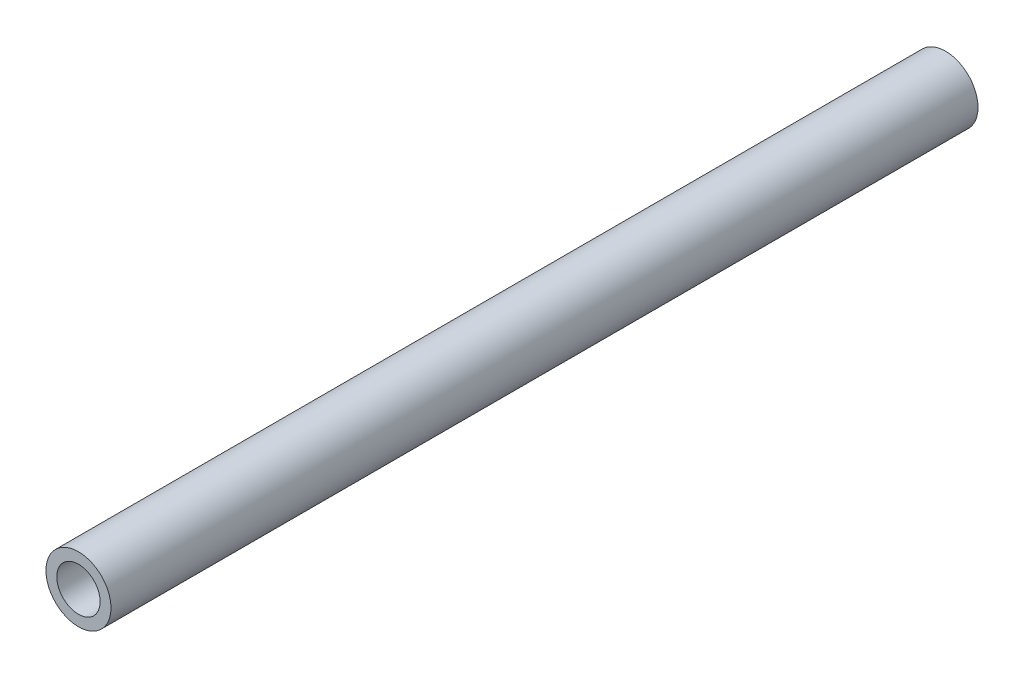
ISO-10303-21;
HEADER;
FILE_DESCRIPTION(('STEP AP214'),'2;1');
FILE_NAME('part.step','',(''),(''),'','','');
FILE_SCHEMA(('AUTOMOTIVE_DESIGN { 1 0 10303 214 1 1 1 1 }'));
ENDSEC;
DATA;
#1=APPLICATION_CONTEXT('core data for automotive mechanical design processes');
#2=APPLICATION_PROTOCOL_DEFINITION('international standard','automotive_design',2000,#1);
#3=PRODUCT_CONTEXT('',#1,'mechanical');
#4=PRODUCT('Part','Part','',(#3));
#5=PRODUCT_RELATED_PRODUCT_CATEGORY('part','',(#4));
#6=PRODUCT_DEFINITION_FORMATION('','',#4);
#7=PRODUCT_DEFINITION_CONTEXT('part definition',#1,'design');
#8=PRODUCT_DEFINITION('design','',#6,#7);
#9=PRODUCT_DEFINITION_SHAPE('','',#8);
#10=(LENGTH_UNIT() NAMED_UNIT(*) SI_UNIT(.MILLI.,.METRE.));
#11=(NAMED_UNIT(*) PLANE_ANGLE_UNIT() SI_UNIT($,.RADIAN.));
#12=(NAMED_UNIT(*) SI_UNIT($,.STERADIAN.) SOLID_ANGLE_UNIT());
#13=UNCERTAINTY_MEASURE_WITH_UNIT(LENGTH_MEASURE(1.E-05),#10,'distance_accuracy_value','');
#14=(GEOMETRIC_REPRESENTATION_CONTEXT(3) GLOBAL_UNCERTAINTY_ASSIGNED_CONTEXT((#13)) GLOBAL_UNIT_ASSIGNED_CONTEXT((#10,
#11,#12)) REPRESENTATION_CONTEXT('',''));
#15=CARTESIAN_POINT('',(0.,0.,0.));
#16=DIRECTION('',(0.,0.,1.));
#17=DIRECTION('',(1.,0.,0.));
#18=AXIS2_PLACEMENT_3D('',#15,#16,#17);
#19=CARTESIAN_POINT('',(0.,0.,80.));
#20=DIRECTION('',(0.,0.,1.));
#21=DIRECTION('',(1.,0.,0.));
#22=AXIS2_PLACEMENT_3D('',#19,#20,#21);
#23=PLANE('',#22);
#24=CARTESIAN_POINT('',(0.,0.,80.));
#25=DIRECTION('',(0.,0.,1.));
#26=DIRECTION('',(1.,0.,0.));
#27=AXIS2_PLACEMENT_3D('',#24,#25,#26);
#28=CIRCLE('',#27,3.);
#29=CARTESIAN_POINT('',(3.,0.,80.));
#30=VERTEX_POINT('',#29);
#31=EDGE_CURVE('E11',#30,#30,#28,.T.);
#32=ORIENTED_EDGE('',*,*,#31,.T.);
#33=EDGE_LOOP('',(#32));
#34=FACE_BOUND('',#33,.T.);
#35=CARTESIAN_POINT('',(0.,0.,80.));
#36=DIRECTION('',(0.,0.,1.));
#37=DIRECTION('',(1.,0.,0.));
#38=AXIS2_PLACEMENT_3D('',#35,#36,#37);
#39=CIRCLE('',#38,2.);
#40=CARTESIAN_POINT('',(2.,0.,80.));
#41=VERTEX_POINT('',#40);
#42=EDGE_CURVE('E48',#41,#41,#39,.T.);
#43=ORIENTED_EDGE('',*,*,#42,.F.);
#44=EDGE_LOOP('',(#43));
#45=FACE_BOUND('',#44,.T.);
#46=ADVANCED_FACE('F37',(#34,#45),#23,.T.);
#47=CARTESIAN_POINT('',(0.,0.,0.));
#48=DIRECTION('',(0.,0.,1.));
#49=DIRECTION('',(1.,0.,0.));
#50=AXIS2_PLACEMENT_3D('',#47,#48,#49);
#51=PLANE('',#50);
#52=CARTESIAN_POINT('',(0.,0.,0.));
#53=DIRECTION('',(0.,0.,1.));
#54=DIRECTION('',(1.,0.,0.));
#55=AXIS2_PLACEMENT_3D('',#52,#53,#54);
#56=CIRCLE('',#55,3.);
#57=CARTESIAN_POINT('',(3.,0.,0.));
#58=VERTEX_POINT('',#57);
#59=EDGE_CURVE('E41',#58,#58,#56,.T.);
#60=ORIENTED_EDGE('',*,*,#59,.F.);
#61=EDGE_LOOP('',(#60));
#62=FACE_BOUND('',#61,.T.);
#63=CARTESIAN_POINT('',(0.,0.,0.));
#64=DIRECTION('',(0.,0.,1.));
#65=DIRECTION('',(1.,0.,0.));
#66=AXIS2_PLACEMENT_3D('',#63,#64,#65);
#67=CIRCLE('',#66,2.);
#68=CARTESIAN_POINT('',(2.,0.,0.));
#69=VERTEX_POINT('',#68);
#70=EDGE_CURVE('E50',#69,#69,#67,.T.);
#71=ORIENTED_EDGE('',*,*,#70,.T.);
#72=EDGE_LOOP('',(#71));
#73=FACE_BOUND('',#72,.T.);
#74=ADVANCED_FACE('F60',(#62,#73),#51,.F.);
#75=CARTESIAN_POINT('',(0.,0.,80.));
#76=DIRECTION('',(0.,0.,-1.));
#77=DIRECTION('',(-1.,0.,0.));
#78=AXIS2_PLACEMENT_3D('',#75,#76,#77);
#79=CYLINDRICAL_SURFACE('',#78,3.);
#80=ORIENTED_EDGE('',*,*,#31,.F.);
#81=EDGE_LOOP('',(#80));
#82=FACE_BOUND('',#81,.T.);
#83=ORIENTED_EDGE('',*,*,#59,.T.);
#84=EDGE_LOOP('',(#83));
#85=FACE_BOUND('',#84,.T.);
#86=ADVANCED_FACE('F39',(#82,#85),#79,.T.);
#87=CARTESIAN_POINT('',(0.,0.,80.));
#88=DIRECTION('',(0.,0.,-1.));
#89=DIRECTION('',(-1.,0.,0.));
#90=AXIS2_PLACEMENT_3D('',#87,#88,#89);
#91=CYLINDRICAL_SURFACE('',#90,2.);
#92=ORIENTED_EDGE('',*,*,#42,.T.);
#93=EDGE_LOOP('',(#92));
#94=FACE_BOUND('',#93,.T.);
#95=ORIENTED_EDGE('',*,*,#70,.F.);
#96=EDGE_LOOP('',(#95));
#97=FACE_BOUND('',#96,.T.);
#98=ADVANCED_FACE('F56',(#94,#97),#91,.F.);
#99=CLOSED_SHELL('',(#46,#74,#86,#98));
#100=MANIFOLD_SOLID_BREP('B2',#99);
#101=ADVANCED_BREP_SHAPE_REPRESENTATION('',(#18,#100),#14);
#102=SHAPE_DEFINITION_REPRESENTATION(#9,#101);
ENDSEC;
END-ISO-10303-21;
